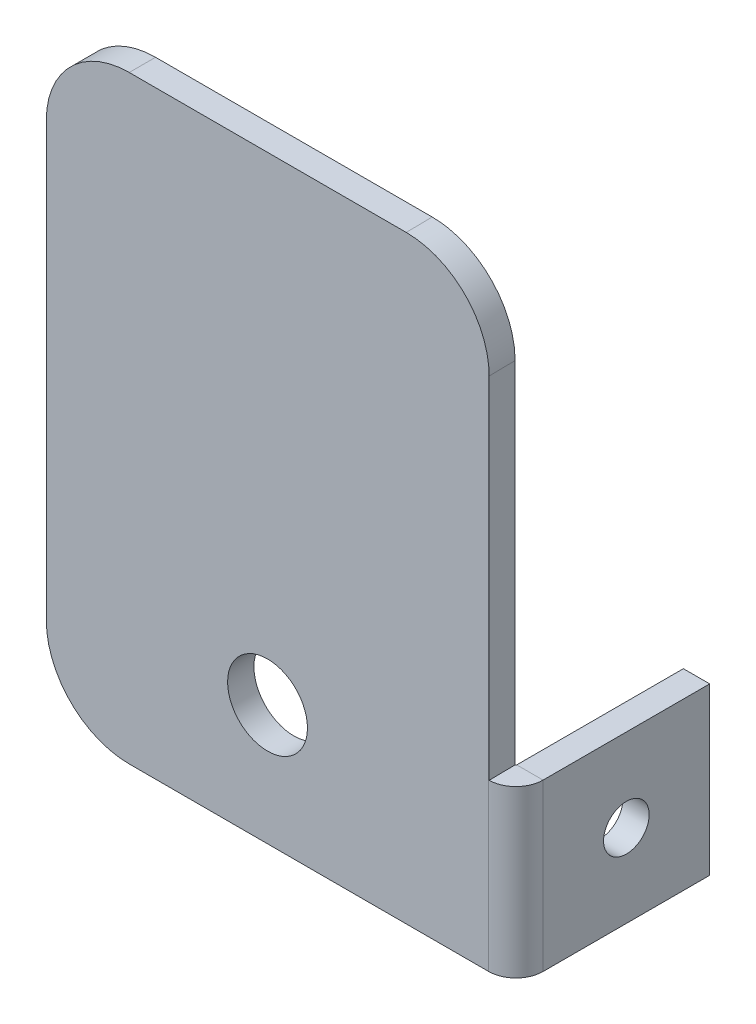
ISO-10303-21;
HEADER;
FILE_DESCRIPTION(('STEP AP214'),'2;1');
FILE_NAME('part.step','',(''),(''),'','','');
FILE_SCHEMA(('AUTOMOTIVE_DESIGN { 1 0 10303 214 1 1 1 1 }'));
ENDSEC;
DATA;
#1=APPLICATION_CONTEXT('core data for automotive mechanical design processes');
#2=APPLICATION_PROTOCOL_DEFINITION('international standard','automotive_design',2000,#1);
#3=PRODUCT_CONTEXT('',#1,'mechanical');
#4=PRODUCT('Part','Part','',(#3));
#5=PRODUCT_RELATED_PRODUCT_CATEGORY('part','',(#4));
#6=PRODUCT_DEFINITION_FORMATION('','',#4);
#7=PRODUCT_DEFINITION_CONTEXT('part definition',#1,'design');
#8=PRODUCT_DEFINITION('design','',#6,#7);
#9=PRODUCT_DEFINITION_SHAPE('','',#8);
#10=(LENGTH_UNIT() NAMED_UNIT(*) SI_UNIT(.MILLI.,.METRE.));
#11=(NAMED_UNIT(*) PLANE_ANGLE_UNIT() SI_UNIT($,.RADIAN.));
#12=(NAMED_UNIT(*) SI_UNIT($,.STERADIAN.) SOLID_ANGLE_UNIT());
#13=UNCERTAINTY_MEASURE_WITH_UNIT(LENGTH_MEASURE(1.E-05),#10,'distance_accuracy_value','');
#14=(GEOMETRIC_REPRESENTATION_CONTEXT(3) GLOBAL_UNCERTAINTY_ASSIGNED_CONTEXT((#13)) GLOBAL_UNIT_ASSIGNED_CONTEXT((#10,
#11,#12)) REPRESENTATION_CONTEXT('',''));
#15=CARTESIAN_POINT('',(0.,0.,0.));
#16=DIRECTION('',(0.,0.,1.));
#17=DIRECTION('',(1.,0.,0.));
#18=AXIS2_PLACEMENT_3D('',#15,#16,#17);
#19=CARTESIAN_POINT('',(26.7316212801133,-30.,6.625));
#20=DIRECTION('',(0.,1.,0.));
#21=DIRECTION('',(1.,0.,0.));
#22=AXIS2_PLACEMENT_3D('',#19,#20,#21);
#23=PLANE('',#22);
#24=DIRECTION('',(0.,0.,1.));
#25=VECTOR('',#24,1.);
#26=CARTESIAN_POINT('',(26.7316212801133,-30.,6.625));
#27=LINE('',#26,#25);
#28=CARTESIAN_POINT('',(26.7316212801132,-30.,-23.375));
#29=VERTEX_POINT('',#28);
#30=CARTESIAN_POINT('',(26.7316212801132,-30.,-3.275));
#31=VERTEX_POINT('',#30);
#32=EDGE_CURVE('E202',#29,#31,#27,.T.);
#33=ORIENTED_EDGE('',*,*,#32,.T.);
#34=DIRECTION('',(1.,0.,0.));
#35=VECTOR('',#34,1.);
#36=CARTESIAN_POINT('',(26.7316212801132,-30.,-3.275));
#37=LINE('',#36,#35);
#38=CARTESIAN_POINT('',(29.9066212801132,-30.,-3.27500000000001));
#39=VERTEX_POINT('',#38);
#40=EDGE_CURVE('E159',#31,#39,#37,.T.);
#41=ORIENTED_EDGE('',*,*,#40,.T.);
#42=DIRECTION('',(0.,0.,1.));
#43=VECTOR('',#42,1.);
#44=CARTESIAN_POINT('',(29.9066212801133,-30.,6.62499999999998));
#45=LINE('',#44,#43);
#46=CARTESIAN_POINT('',(29.9066212801132,-30.,-23.375));
#47=VERTEX_POINT('',#46);
#48=EDGE_CURVE('E207',#47,#39,#45,.T.);
#49=ORIENTED_EDGE('',*,*,#48,.F.);
#50=DIRECTION('',(1.,0.,0.));
#51=VECTOR('',#50,1.);
#52=CARTESIAN_POINT('',(26.7316212801132,-30.,-23.375));
#53=LINE('',#52,#51);
#54=EDGE_CURVE('E208',#29,#47,#53,.T.);
#55=ORIENTED_EDGE('',*,*,#54,.F.);
#56=EDGE_LOOP('',(#33,#41,#49,#55));
#57=FACE_BOUND('',#56,.T.);
#58=ADVANCED_FACE('F42',(#57),#23,.T.);
#59=CARTESIAN_POINT('',(26.7316212801135,-50.,60.0882425602265));
#60=DIRECTION('',(0.,-1.,0.));
#61=DIRECTION('',(0.,0.,-1.));
#62=AXIS2_PLACEMENT_3D('',#59,#60,#61);
#63=PLANE('',#62);
#64=DIRECTION('',(0.,0.,-1.));
#65=VECTOR('',#64,1.);
#66=CARTESIAN_POINT('',(29.9066212801135,-50.,60.0882425602265));
#67=LINE('',#66,#65);
#68=CARTESIAN_POINT('',(29.9066212801132,-50.,-3.27500000000001));
#69=VERTEX_POINT('',#68);
#70=CARTESIAN_POINT('',(29.9066212801132,-50.,-23.375));
#71=VERTEX_POINT('',#70);
#72=EDGE_CURVE('E177',#69,#71,#67,.T.);
#73=ORIENTED_EDGE('',*,*,#72,.F.);
#74=DIRECTION('',(-1.,0.,0.));
#75=VECTOR('',#74,1.);
#76=CARTESIAN_POINT('',(26.7316212801132,-50.,-3.275));
#77=LINE('',#76,#75);
#78=CARTESIAN_POINT('',(26.7316212801132,-50.,-3.275));
#79=VERTEX_POINT('',#78);
#80=EDGE_CURVE('E215',#69,#79,#77,.T.);
#81=ORIENTED_EDGE('',*,*,#80,.T.);
#82=DIRECTION('',(0.,0.,-1.));
#83=VECTOR('',#82,1.);
#84=CARTESIAN_POINT('',(26.7316212801135,-50.,60.0882425602265));
#85=LINE('',#84,#83);
#86=CARTESIAN_POINT('',(26.7316212801132,-50.,-23.375));
#87=VERTEX_POINT('',#86);
#88=EDGE_CURVE('E203',#79,#87,#85,.T.);
#89=ORIENTED_EDGE('',*,*,#88,.T.);
#90=DIRECTION('',(1.,0.,0.));
#91=VECTOR('',#90,1.);
#92=CARTESIAN_POINT('',(26.7316212801132,-50.,-23.375));
#93=LINE('',#92,#91);
#94=EDGE_CURVE('E211',#87,#71,#93,.T.);
#95=ORIENTED_EDGE('',*,*,#94,.T.);
#96=EDGE_LOOP('',(#73,#81,#89,#95));
#97=FACE_BOUND('',#96,.T.);
#98=ADVANCED_FACE('F304',(#97),#63,.T.);
#99=CARTESIAN_POINT('',(29.9066212801134,0.,33.3566212801132));
#100=DIRECTION('',(1.,0.,0.));
#101=DIRECTION('',(0.,0.,-1.));
#102=AXIS2_PLACEMENT_3D('',#99,#100,#101);
#103=PLANE('',#102);
#104=CARTESIAN_POINT('',(29.9066212801133,-40.,-13.325));
#105=DIRECTION('',(-1.,0.,0.));
#106=DIRECTION('',(0.,0.,1.));
#107=AXIS2_PLACEMENT_3D('',#104,#105,#106);
#108=CIRCLE('',#107,2.75);
#109=CARTESIAN_POINT('',(29.9066212801133,-40.,-10.575));
#110=VERTEX_POINT('',#109);
#111=EDGE_CURVE('E365',#110,#110,#108,.T.);
#112=ORIENTED_EDGE('',*,*,#111,.T.);
#113=EDGE_LOOP('',(#112));
#114=FACE_BOUND('',#113,.T.);
#115=ORIENTED_EDGE('',*,*,#48,.T.);
#116=DIRECTION('',(0.,-1.,0.));
#117=VECTOR('',#116,1.);
#118=CARTESIAN_POINT('',(29.9066212801132,0.,-3.27500000000001));
#119=LINE('',#118,#117);
#120=EDGE_CURVE('E217',#39,#69,#119,.T.);
#121=ORIENTED_EDGE('',*,*,#120,.T.);
#122=ORIENTED_EDGE('',*,*,#72,.T.);
#123=DIRECTION('',(0.,1.,0.));
#124=VECTOR('',#123,1.);
#125=CARTESIAN_POINT('',(29.9066212801132,-30.,-23.375));
#126=LINE('',#125,#124);
#127=EDGE_CURVE('E204',#71,#47,#126,.T.);
#128=ORIENTED_EDGE('',*,*,#127,.T.);
#129=EDGE_LOOP('',(#115,#121,#122,#128));
#130=FACE_BOUND('',#129,.T.);
#131=ADVANCED_FACE('F299',(#114,#130),#103,.T.);
#132=CARTESIAN_POINT('',(26.7316212801132,-30.,-23.375));
#133=DIRECTION('',(0.,0.,-1.));
#134=DIRECTION('',(-1.,0.,0.));
#135=AXIS2_PLACEMENT_3D('',#132,#133,#134);
#136=PLANE('',#135);
#137=ORIENTED_EDGE('',*,*,#127,.F.);
#138=ORIENTED_EDGE('',*,*,#94,.F.);
#139=DIRECTION('',(0.,1.,0.));
#140=VECTOR('',#139,1.);
#141=CARTESIAN_POINT('',(26.7316212801132,-30.,-23.375));
#142=LINE('',#141,#140);
#143=EDGE_CURVE('E199',#87,#29,#142,.T.);
#144=ORIENTED_EDGE('',*,*,#143,.T.);
#145=ORIENTED_EDGE('',*,*,#54,.T.);
#146=EDGE_LOOP('',(#137,#138,#144,#145));
#147=FACE_BOUND('',#146,.T.);
#148=ADVANCED_FACE('F296',(#147),#136,.T.);
#149=CARTESIAN_POINT('',(26.7316212801134,0.,33.3566212801132));
#150=DIRECTION('',(1.,0.,0.));
#151=DIRECTION('',(0.,0.,-1.));
#152=AXIS2_PLACEMENT_3D('',#149,#150,#151);
#153=PLANE('',#152);
#154=CARTESIAN_POINT('',(26.7316212801132,-40.,-13.325));
#155=DIRECTION('',(-1.,0.,0.));
#156=DIRECTION('',(0.,0.,1.));
#157=AXIS2_PLACEMENT_3D('',#154,#155,#156);
#158=CIRCLE('',#157,2.75);
#159=CARTESIAN_POINT('',(26.7316212801132,-40.,-10.575));
#160=VERTEX_POINT('',#159);
#161=EDGE_CURVE('E368',#160,#160,#158,.T.);
#162=ORIENTED_EDGE('',*,*,#161,.F.);
#163=EDGE_LOOP('',(#162));
#164=FACE_BOUND('',#163,.T.);
#165=DIRECTION('',(0.,-1.,0.));
#166=VECTOR('',#165,1.);
#167=CARTESIAN_POINT('',(26.7316212801132,0.,-3.275));
#168=LINE('',#167,#166);
#169=EDGE_CURVE('E210',#31,#79,#168,.T.);
#170=ORIENTED_EDGE('',*,*,#169,.F.);
#171=ORIENTED_EDGE('',*,*,#32,.F.);
#172=ORIENTED_EDGE('',*,*,#143,.F.);
#173=ORIENTED_EDGE('',*,*,#88,.F.);
#174=EDGE_LOOP('',(#170,#171,#172,#173));
#175=FACE_BOUND('',#174,.T.);
#176=ADVANCED_FACE('F280',(#164,#175),#153,.F.);
#177=CARTESIAN_POINT('',(-26.7316212801132,22.2316212801132,-3.175));
#178=DIRECTION('',(-1.,0.,0.));
#179=DIRECTION('',(0.,-1.,0.));
#180=AXIS2_PLACEMENT_3D('',#177,#178,#179);
#181=PLANE('',#180);
#182=DIRECTION('',(0.,-1.,0.));
#183=VECTOR('',#182,1.);
#184=CARTESIAN_POINT('',(-26.7316212801132,22.2316212801132,-3.175));
#185=LINE('',#184,#183);
#186=CARTESIAN_POINT('',(-26.7316212801132,12.2316212801132,-3.175));
#187=VERTEX_POINT('',#186);
#188=CARTESIAN_POINT('',(-26.7316212801132,-40.,-3.175));
#189=VERTEX_POINT('',#188);
#190=EDGE_CURVE('E191',#187,#189,#185,.T.);
#191=ORIENTED_EDGE('',*,*,#190,.T.);
#192=DIRECTION('',(0.,0.,1.));
#193=VECTOR('',#192,1.);
#194=CARTESIAN_POINT('',(-26.7316212801132,-40.,-3.175));
#195=LINE('',#194,#193);
#196=CARTESIAN_POINT('',(-26.7316212801132,-40.,0.));
#197=VERTEX_POINT('',#196);
#198=EDGE_CURVE('E230',#189,#197,#195,.T.);
#199=ORIENTED_EDGE('',*,*,#198,.T.);
#200=DIRECTION('',(0.,-1.,0.));
#201=VECTOR('',#200,1.);
#202=CARTESIAN_POINT('',(-26.7316212801132,22.2316212801132,0.));
#203=LINE('',#202,#201);
#204=CARTESIAN_POINT('',(-26.7316212801132,12.2316212801132,0.));
#205=VERTEX_POINT('',#204);
#206=EDGE_CURVE('E180',#205,#197,#203,.T.);
#207=ORIENTED_EDGE('',*,*,#206,.F.);
#208=DIRECTION('',(0.,0.,1.));
#209=VECTOR('',#208,1.);
#210=CARTESIAN_POINT('',(-26.7316212801132,12.2316212801132,-3.175));
#211=LINE('',#210,#209);
#212=EDGE_CURVE('E221',#205,#187,#211,.F.);
#213=ORIENTED_EDGE('',*,*,#212,.T.);
#214=EDGE_LOOP('',(#191,#199,#207,#213));
#215=FACE_BOUND('',#214,.T.);
#216=ADVANCED_FACE('F276',(#215),#181,.T.);
#217=CARTESIAN_POINT('',(0.,0.,-3.175));
#218=DIRECTION('',(0.,0.,1.));
#219=DIRECTION('',(1.,0.,0.));
#220=AXIS2_PLACEMENT_3D('',#217,#218,#219);
#221=PLANE('',#220);
#222=CARTESIAN_POINT('',(-0.049999999999991,-35.5,-3.175));
#223=DIRECTION('',(0.,0.,-1.));
#224=DIRECTION('',(-1.,0.,0.));
#225=AXIS2_PLACEMENT_3D('',#222,#223,#224);
#226=CIRCLE('',#225,4.815);
#227=CARTESIAN_POINT('',(-4.86499999999999,-35.5,-3.175));
#228=VERTEX_POINT('',#227);
#229=EDGE_CURVE('E166',#228,#228,#226,.T.);
#230=ORIENTED_EDGE('',*,*,#229,.F.);
#231=EDGE_LOOP('',(#230));
#232=FACE_BOUND('',#231,.T.);
#233=DIRECTION('',(1.,0.,0.));
#234=VECTOR('',#233,1.);
#235=CARTESIAN_POINT('',(-26.7316212801132,-50.,-3.175));
#236=LINE('',#235,#234);
#237=CARTESIAN_POINT('',(-16.7316212801132,-50.,-3.175));
#238=VERTEX_POINT('',#237);
#239=CARTESIAN_POINT('',(26.6316212801132,-50.,-3.175));
#240=VERTEX_POINT('',#239);
#241=EDGE_CURVE('E186',#238,#240,#236,.T.);
#242=ORIENTED_EDGE('',*,*,#241,.F.);
#243=CARTESIAN_POINT('',(-16.7316212801132,-40.,-3.175));
#244=DIRECTION('',(0.,0.,1.));
#245=DIRECTION('',(1.,0.,0.));
#246=AXIS2_PLACEMENT_3D('',#243,#244,#245);
#247=CIRCLE('',#246,10.);
#248=EDGE_CURVE('E245',#238,#189,#247,.F.);
#249=ORIENTED_EDGE('',*,*,#248,.T.);
#250=ORIENTED_EDGE('',*,*,#190,.F.);
#251=CARTESIAN_POINT('',(-16.7316212801132,12.2316212801132,-3.175));
#252=DIRECTION('',(0.,0.,1.));
#253=DIRECTION('',(1.,0.,0.));
#254=AXIS2_PLACEMENT_3D('',#251,#252,#253);
#255=CIRCLE('',#254,10.);
#256=CARTESIAN_POINT('',(-16.7316212801132,22.2316212801132,-3.175));
#257=VERTEX_POINT('',#256);
#258=EDGE_CURVE('E243',#187,#257,#255,.F.);
#259=ORIENTED_EDGE('',*,*,#258,.T.);
#260=DIRECTION('',(-1.,0.,0.));
#261=VECTOR('',#260,1.);
#262=CARTESIAN_POINT('',(26.7316212801132,22.2316212801132,-3.175));
#263=LINE('',#262,#261);
#264=CARTESIAN_POINT('',(16.631958378248,22.2316212801132,-3.175));
#265=VERTEX_POINT('',#264);
#266=EDGE_CURVE('E174',#265,#257,#263,.T.);
#267=ORIENTED_EDGE('',*,*,#266,.F.);
#268=CARTESIAN_POINT('',(16.631958378248,12.2316212801132,-3.175));
#269=DIRECTION('',(0.,0.,1.));
#270=DIRECTION('',(1.,0.,0.));
#271=AXIS2_PLACEMENT_3D('',#268,#269,#270);
#272=ELLIPSE('',#271,10.0012338273976,10.);
#273=CARTESIAN_POINT('',(26.6316212801132,12.4088560606318,-3.175));
#274=VERTEX_POINT('',#273);
#275=EDGE_CURVE('E241',#265,#274,#272,.F.);
#276=ORIENTED_EDGE('',*,*,#275,.T.);
#277=DIRECTION('',(0.,-1.,0.));
#278=VECTOR('',#277,1.);
#279=CARTESIAN_POINT('',(26.6316212801132,0.,-3.175));
#280=LINE('',#279,#278);
#281=EDGE_CURVE('E189',#274,#240,#280,.T.);
#282=ORIENTED_EDGE('',*,*,#281,.T.);
#283=EDGE_LOOP('',(#242,#249,#250,#259,#267,#276,#282));
#284=FACE_BOUND('',#283,.T.);
#285=ADVANCED_FACE('F279',(#232,#284),#221,.F.);
#286=CARTESIAN_POINT('',(-26.7316212801132,-50.,-3.175));
#287=DIRECTION('',(0.,-1.,0.));
#288=DIRECTION('',(1.,0.,0.));
#289=AXIS2_PLACEMENT_3D('',#286,#287,#288);
#290=PLANE('',#289);
#291=DIRECTION('',(1.,0.,0.));
#292=VECTOR('',#291,1.);
#293=CARTESIAN_POINT('',(-26.7316212801132,-50.,0.));
#294=LINE('',#293,#292);
#295=CARTESIAN_POINT('',(-16.7316212801132,-50.,0.));
#296=VERTEX_POINT('',#295);
#297=CARTESIAN_POINT('',(26.6316212801132,-50.,0.));
#298=VERTEX_POINT('',#297);
#299=EDGE_CURVE('E178',#296,#298,#294,.T.);
#300=ORIENTED_EDGE('',*,*,#299,.F.);
#301=DIRECTION('',(0.,0.,1.));
#302=VECTOR('',#301,1.);
#303=CARTESIAN_POINT('',(-16.7316212801132,-50.,-3.175));
#304=LINE('',#303,#302);
#305=EDGE_CURVE('E239',#296,#238,#304,.F.);
#306=ORIENTED_EDGE('',*,*,#305,.T.);
#307=ORIENTED_EDGE('',*,*,#241,.T.);
#308=DIRECTION('',(0.,0.,-1.));
#309=VECTOR('',#308,1.);
#310=CARTESIAN_POINT('',(26.6316212801132,-50.,-3.175));
#311=LINE('',#310,#309);
#312=EDGE_CURVE('E194',#298,#240,#311,.T.);
#313=ORIENTED_EDGE('',*,*,#312,.F.);
#314=EDGE_LOOP('',(#300,#306,#307,#313));
#315=FACE_BOUND('',#314,.T.);
#316=ADVANCED_FACE('F284',(#315),#290,.T.);
#317=CARTESIAN_POINT('',(0.,0.,0.));
#318=DIRECTION('',(0.,0.,1.));
#319=DIRECTION('',(1.,0.,0.));
#320=AXIS2_PLACEMENT_3D('',#317,#318,#319);
#321=PLANE('',#320);
#322=CARTESIAN_POINT('',(-0.049999999999991,-35.5,0.));
#323=DIRECTION('',(0.,0.,1.));
#324=DIRECTION('',(1.,0.,0.));
#325=AXIS2_PLACEMENT_3D('',#322,#323,#324);
#326=CIRCLE('',#325,4.815);
#327=CARTESIAN_POINT('',(4.76500000000001,-35.5,0.));
#328=VERTEX_POINT('',#327);
#329=EDGE_CURVE('E172',#328,#328,#326,.T.);
#330=ORIENTED_EDGE('',*,*,#329,.F.);
#331=EDGE_LOOP('',(#330));
#332=FACE_BOUND('',#331,.T.);
#333=ORIENTED_EDGE('',*,*,#206,.T.);
#334=CARTESIAN_POINT('',(-16.7316212801132,-40.,0.));
#335=DIRECTION('',(0.,0.,1.));
#336=DIRECTION('',(1.,0.,0.));
#337=AXIS2_PLACEMENT_3D('',#334,#335,#336);
#338=CIRCLE('',#337,10.);
#339=EDGE_CURVE('E237',#197,#296,#338,.T.);
#340=ORIENTED_EDGE('',*,*,#339,.T.);
#341=ORIENTED_EDGE('',*,*,#299,.T.);
#342=DIRECTION('',(0.,-1.,0.));
#343=VECTOR('',#342,1.);
#344=CARTESIAN_POINT('',(26.6316212801132,0.,0.));
#345=LINE('',#344,#343);
#346=CARTESIAN_POINT('',(26.6316212801132,13.2446282197171,0.));
#347=VERTEX_POINT('',#346);
#348=EDGE_CURVE('E154',#347,#298,#345,.T.);
#349=ORIENTED_EDGE('',*,*,#348,.F.);
#350=CARTESIAN_POINT('',(16.6818352639006,12.2316212801132,0.));
#351=DIRECTION('',(0.,0.,1.));
#352=DIRECTION('',(1.,0.,0.));
#353=AXIS2_PLACEMENT_3D('',#350,#351,#352);
#354=ELLIPSE('',#353,10.0012338273976,10.);
#355=CARTESIAN_POINT('',(16.6818352639006,22.2316212801132,0.));
#356=VERTEX_POINT('',#355);
#357=EDGE_CURVE('E233',#347,#356,#354,.T.);
#358=ORIENTED_EDGE('',*,*,#357,.T.);
#359=DIRECTION('',(-1.,0.,0.));
#360=VECTOR('',#359,1.);
#361=CARTESIAN_POINT('',(26.7316212801132,22.2316212801132,0.));
#362=LINE('',#361,#360);
#363=CARTESIAN_POINT('',(-16.7316212801132,22.2316212801132,0.));
#364=VERTEX_POINT('',#363);
#365=EDGE_CURVE('E183',#356,#364,#362,.T.);
#366=ORIENTED_EDGE('',*,*,#365,.T.);
#367=CARTESIAN_POINT('',(-16.7316212801132,12.2316212801132,0.));
#368=DIRECTION('',(0.,0.,1.));
#369=DIRECTION('',(1.,0.,0.));
#370=AXIS2_PLACEMENT_3D('',#367,#368,#369);
#371=CIRCLE('',#370,10.);
#372=EDGE_CURVE('E235',#364,#205,#371,.T.);
#373=ORIENTED_EDGE('',*,*,#372,.T.);
#374=EDGE_LOOP('',(#333,#340,#341,#349,#358,#366,#373));
#375=FACE_BOUND('',#374,.T.);
#376=ADVANCED_FACE('F288',(#332,#375),#321,.T.);
#377=CARTESIAN_POINT('',(26.7316212801132,22.2316212801132,-3.175));
#378=DIRECTION('',(0.,1.,0.));
#379=DIRECTION('',(0.,0.,1.));
#380=AXIS2_PLACEMENT_3D('',#377,#378,#379);
#381=PLANE('',#380);
#382=ORIENTED_EDGE('',*,*,#266,.T.);
#383=DIRECTION('',(0.,0.,1.));
#384=VECTOR('',#383,1.);
#385=CARTESIAN_POINT('',(-16.7316212801132,22.2316212801132,-3.175));
#386=LINE('',#385,#384);
#387=EDGE_CURVE('E250',#257,#364,#386,.T.);
#388=ORIENTED_EDGE('',*,*,#387,.T.);
#389=ORIENTED_EDGE('',*,*,#365,.F.);
#390=DIRECTION('',(0.0157073173118194,0.,0.999876632481661));
#391=VECTOR('',#390,1.);
#392=CARTESIAN_POINT('',(16.6344501652323,22.2316212801132,-3.01638096090961));
#393=LINE('',#392,#391);
#394=EDGE_CURVE('E247',#356,#265,#393,.F.);
#395=ORIENTED_EDGE('',*,*,#394,.T.);
#396=EDGE_LOOP('',(#382,#388,#389,#395));
#397=FACE_BOUND('',#396,.T.);
#398=ADVANCED_FACE('F273',(#397),#381,.T.);
#399=CARTESIAN_POINT('',(26.6316212801132,-30.,-3.275));
#400=DIRECTION('',(0.,-1.,0.));
#401=DIRECTION('',(0.,0.,-1.));
#402=AXIS2_PLACEMENT_3D('',#399,#400,#401);
#403=PLANE('',#402);
#404=DIRECTION('',(-0.0157073173118195,0.,-0.999876632481661));
#405=VECTOR('',#404,1.);
#406=CARTESIAN_POINT('',(26.6331920118444,-30.,-3.17501233675183));
#407=LINE('',#406,#405);
#408=CARTESIAN_POINT('',(26.6830627443095,-30.,-0.000404028622561642));
#409=VERTEX_POINT('',#408);
#410=CARTESIAN_POINT('',(26.6331920118444,-30.,-3.17501233675183));
#411=VERTEX_POINT('',#410);
#412=EDGE_CURVE('E145',#409,#411,#407,.T.);
#413=ORIENTED_EDGE('',*,*,#412,.F.);
#414=CARTESIAN_POINT('',(26.6316212801132,-30.,-3.275));
#415=DIRECTION('',(0.,-1.,0.));
#416=DIRECTION('',(0.,0.,-1.));
#417=AXIS2_PLACEMENT_3D('',#414,#415,#416);
#418=CIRCLE('',#417,3.275);
#419=EDGE_CURVE('E171',#409,#39,#418,.F.);
#420=ORIENTED_EDGE('',*,*,#419,.T.);
#421=ORIENTED_EDGE('',*,*,#40,.F.);
#422=CARTESIAN_POINT('',(26.6316212801132,-30.,-3.275));
#423=DIRECTION('',(0.,1.,0.));
#424=DIRECTION('',(0.,0.,-1.));
#425=AXIS2_PLACEMENT_3D('',#422,#423,#424);
#426=CIRCLE('',#425,0.0999999999999998);
#427=EDGE_CURVE('E144',#411,#31,#426,.T.);
#428=ORIENTED_EDGE('',*,*,#427,.F.);
#429=EDGE_LOOP('',(#413,#420,#421,#428));
#430=FACE_BOUND('',#429,.T.);
#431=ADVANCED_FACE('F157',(#430),#403,.F.);
#432=CARTESIAN_POINT('',(26.6316212801132,-50.,-3.275));
#433=DIRECTION('',(0.,1.,0.));
#434=DIRECTION('',(0.,0.,1.));
#435=AXIS2_PLACEMENT_3D('',#432,#433,#434);
#436=PLANE('',#435);
#437=ORIENTED_EDGE('',*,*,#80,.F.);
#438=CARTESIAN_POINT('',(26.6316212801132,-50.,-3.275));
#439=DIRECTION('',(0.,-1.,0.));
#440=DIRECTION('',(0.,0.,-1.));
#441=AXIS2_PLACEMENT_3D('',#438,#439,#440);
#442=CIRCLE('',#441,3.275);
#443=EDGE_CURVE('E163',#69,#298,#442,.T.);
#444=ORIENTED_EDGE('',*,*,#443,.T.);
#445=ORIENTED_EDGE('',*,*,#312,.T.);
#446=CARTESIAN_POINT('',(26.6316212801132,-50.,-3.275));
#447=DIRECTION('',(0.,-1.,0.));
#448=DIRECTION('',(0.,0.,1.));
#449=AXIS2_PLACEMENT_3D('',#446,#447,#448);
#450=CIRCLE('',#449,0.0999999999999996);
#451=EDGE_CURVE('E146',#79,#240,#450,.T.);
#452=ORIENTED_EDGE('',*,*,#451,.F.);
#453=EDGE_LOOP('',(#437,#444,#445,#452));
#454=FACE_BOUND('',#453,.T.);
#455=ADVANCED_FACE('F267',(#454),#436,.F.);
#456=CARTESIAN_POINT('',(26.6331920118444,-3.88418935994338,-3.17501233675183));
#457=DIRECTION('',(-0.999876632481661,0.,0.0157073173118194));
#458=DIRECTION('',(0.,-1.,0.));
#459=AXIS2_PLACEMENT_3D('',#456,#457,#458);
#460=PLANE('',#459);
#461=DIRECTION('',(0.,-1.,0.));
#462=VECTOR('',#461,1.);
#463=CARTESIAN_POINT('',(26.6331920118444,-30.,-3.17501233675183));
#464=LINE('',#463,#462);
#465=CARTESIAN_POINT('',(26.6331920118444,12.2316212801132,-3.17501233675183));
#466=VERTEX_POINT('',#465);
#467=EDGE_CURVE('E139',#466,#411,#464,.T.);
#468=ORIENTED_EDGE('',*,*,#467,.F.);
#469=DIRECTION('',(-0.0157073173118194,0.,-0.999876632481661));
#470=VECTOR('',#469,1.);
#471=CARTESIAN_POINT('',(26.6331920118444,12.2316212801132,-3.17501233675183));
#472=LINE('',#471,#470);
#473=CARTESIAN_POINT('',(26.6830627443095,12.2316212801132,-0.000404028622561642));
#474=VERTEX_POINT('',#473);
#475=EDGE_CURVE('E55',#466,#474,#472,.F.);
#476=ORIENTED_EDGE('',*,*,#475,.T.);
#477=DIRECTION('',(0.,-1.,0.));
#478=VECTOR('',#477,1.);
#479=CARTESIAN_POINT('',(26.6830627443095,59.1054519445164,-0.000404028622561642));
#480=LINE('',#479,#478);
#481=EDGE_CURVE('E150',#474,#409,#480,.T.);
#482=ORIENTED_EDGE('',*,*,#481,.T.);
#483=ORIENTED_EDGE('',*,*,#412,.T.);
#484=EDGE_LOOP('',(#468,#476,#482,#483));
#485=FACE_BOUND('',#484,.T.);
#486=ADVANCED_FACE('F149',(#485),#460,.F.);
#487=CARTESIAN_POINT('',(26.6316212801132,59.1054519445164,-3.275));
#488=DIRECTION('',(0.,-1.,0.));
#489=DIRECTION('',(0.,0.,-1.));
#490=AXIS2_PLACEMENT_3D('',#487,#488,#489);
#491=CYLINDRICAL_SURFACE('',#490,0.1);
#492=ORIENTED_EDGE('',*,*,#281,.F.);
#493=CARTESIAN_POINT('',(26.6316212801132,12.4088560606318,-3.175));
#494=CARTESIAN_POINT('',(26.6321448764373,12.3793192508439,-3.17500257025657));
#495=CARTESIAN_POINT('',(26.6325375689103,12.3497812809112,-3.17500488344751));
#496=CARTESIAN_POINT('',(26.6330611461542,12.2907030207383,-3.17500899569812));
#497=CARTESIAN_POINT('',(26.6331920309249,12.2611627304982,-3.17501079475779));
#498=CARTESIAN_POINT('',(26.6331920118444,12.2316212801132,-3.17501233675183));
#499=B_SPLINE_CURVE_WITH_KNOTS('',3,(#493,#494,#495,#496,#497,#498),.UNSPECIFIED.,.F.,.F.,(4,2,
4),(0.,0.0886217406976208,0.177243481448913),.UNSPECIFIED.);
#500=EDGE_CURVE('E69',#274,#466,#499,.T.);
#501=ORIENTED_EDGE('',*,*,#500,.T.);
#502=ORIENTED_EDGE('',*,*,#467,.T.);
#503=ORIENTED_EDGE('',*,*,#427,.T.);
#504=ORIENTED_EDGE('',*,*,#169,.T.);
#505=ORIENTED_EDGE('',*,*,#451,.T.);
#506=EDGE_LOOP('',(#492,#501,#502,#503,#504,#505));
#507=FACE_BOUND('',#506,.T.);
#508=ADVANCED_FACE('F141',(#507),#491,.F.);
#509=CARTESIAN_POINT('',(26.6316212801132,59.1054519445164,-3.275));
#510=DIRECTION('',(0.,-1.,0.));
#511=DIRECTION('',(0.,0.,-1.));
#512=AXIS2_PLACEMENT_3D('',#509,#510,#511);
#513=CYLINDRICAL_SURFACE('',#512,3.275);
#514=ORIENTED_EDGE('',*,*,#481,.F.);
#515=CARTESIAN_POINT('',(26.6830627443095,12.2316212801132,-0.000404028622561641));
#516=CARTESIAN_POINT('',(26.6830629411962,12.3162108031963,-0.000406139798762205));
#517=CARTESIAN_POINT('',(26.6819895686025,12.4008003137145,-0.000387169269398488));
#518=CARTESIAN_POINT('',(26.6776985433619,12.5698704712289,-0.000322926388244605));
#519=CARTESIAN_POINT('',(26.6744822704664,12.654351153251,-0.000277670962940551));
#520=CARTESIAN_POINT('',(26.6659082989725,12.8232037821213,-0.000176681843309282));
#521=CARTESIAN_POINT('',(26.6605506003133,12.9075757289665,-0.000120948148684986));
#522=CARTESIAN_POINT('',(26.6476928909653,13.076210862199,-3.36405569606585E-05));
#523=CARTESIAN_POINT('',(26.6401915035284,13.1604739436217,-2.08223418279417E-06));
#524=CARTESIAN_POINT('',(26.6316212801132,13.2446282197171,0.));
#525=B_SPLINE_CURVE_WITH_KNOTS('',3,(#515,#516,#517,#518,#519,#520,#521,#522,#523,#524),
.UNSPECIFIED.,.F.,.F.,(4,2,2,2,4),(0.,0.253761736750389,0.507360241365885,0.760958753171447,
1.01472050181016),.UNSPECIFIED.);
#526=EDGE_CURVE('E12',#474,#347,#525,.T.);
#527=ORIENTED_EDGE('',*,*,#526,.T.);
#528=ORIENTED_EDGE('',*,*,#348,.T.);
#529=ORIENTED_EDGE('',*,*,#443,.F.);
#530=ORIENTED_EDGE('',*,*,#120,.F.);
#531=ORIENTED_EDGE('',*,*,#419,.F.);
#532=EDGE_LOOP('',(#514,#527,#528,#529,#530,#531));
#533=FACE_BOUND('',#532,.T.);
#534=ADVANCED_FACE('F260',(#533),#513,.T.);
#535=CARTESIAN_POINT('',(-0.049999999999991,-35.5,6.825));
#536=DIRECTION('',(0.,0.,-1.));
#537=DIRECTION('',(-1.,0.,0.));
#538=AXIS2_PLACEMENT_3D('',#535,#536,#537);
#539=CYLINDRICAL_SURFACE('',#538,4.815);
#540=ORIENTED_EDGE('',*,*,#329,.T.);
#541=EDGE_LOOP('',(#540));
#542=FACE_BOUND('',#541,.T.);
#543=ORIENTED_EDGE('',*,*,#229,.T.);
#544=EDGE_LOOP('',(#543));
#545=FACE_BOUND('',#544,.T.);
#546=ADVANCED_FACE('F261',(#542,#545),#539,.F.);
#547=CARTESIAN_POINT('',(-16.7316212801132,-40.,-3.175));
#548=DIRECTION('',(0.,0.,1.));
#549=DIRECTION('',(1.,0.,0.));
#550=AXIS2_PLACEMENT_3D('',#547,#548,#549);
#551=CYLINDRICAL_SURFACE('',#550,10.);
#552=ORIENTED_EDGE('',*,*,#248,.F.);
#553=ORIENTED_EDGE('',*,*,#305,.F.);
#554=ORIENTED_EDGE('',*,*,#339,.F.);
#555=ORIENTED_EDGE('',*,*,#198,.F.);
#556=EDGE_LOOP('',(#552,#553,#554,#555));
#557=FACE_BOUND('',#556,.T.);
#558=ADVANCED_FACE('F314',(#557),#551,.T.);
#559=CARTESIAN_POINT('',(-16.7316212801132,12.2316212801132,-3.175));
#560=DIRECTION('',(0.,0.,1.));
#561=DIRECTION('',(1.,0.,0.));
#562=AXIS2_PLACEMENT_3D('',#559,#560,#561);
#563=CYLINDRICAL_SURFACE('',#562,10.);
#564=ORIENTED_EDGE('',*,*,#258,.F.);
#565=ORIENTED_EDGE('',*,*,#212,.F.);
#566=ORIENTED_EDGE('',*,*,#372,.F.);
#567=ORIENTED_EDGE('',*,*,#387,.F.);
#568=EDGE_LOOP('',(#564,#565,#566,#567));
#569=FACE_BOUND('',#568,.T.);
#570=ADVANCED_FACE('F316',(#569),#563,.T.);
#571=CARTESIAN_POINT('',(16.6344501652323,12.2316212801132,-3.01638096090961));
#572=DIRECTION('',(0.0157073173118194,0.,0.999876632481661));
#573=DIRECTION('',(0.999876632481661,0.,-0.0157073173118194));
#574=AXIS2_PLACEMENT_3D('',#571,#572,#573);
#575=CYLINDRICAL_SURFACE('',#574,10.);
#576=ORIENTED_EDGE('',*,*,#526,.F.);
#577=ORIENTED_EDGE('',*,*,#475,.F.);
#578=ORIENTED_EDGE('',*,*,#500,.F.);
#579=ORIENTED_EDGE('',*,*,#275,.F.);
#580=ORIENTED_EDGE('',*,*,#394,.F.);
#581=ORIENTED_EDGE('',*,*,#357,.F.);
#582=EDGE_LOOP('',(#576,#577,#578,#579,#580,#581));
#583=FACE_BOUND('',#582,.T.);
#584=ADVANCED_FACE('F44',(#583),#575,.T.);
#585=CARTESIAN_POINT('',(29.9066212801133,-40.,-13.325));
#586=DIRECTION('',(-1.,0.,0.));
#587=DIRECTION('',(0.,0.,1.));
#588=AXIS2_PLACEMENT_3D('',#585,#586,#587);
#589=CYLINDRICAL_SURFACE('',#588,2.75);
#590=ORIENTED_EDGE('',*,*,#111,.F.);
#591=EDGE_LOOP('',(#590));
#592=FACE_BOUND('',#591,.T.);
#593=ORIENTED_EDGE('',*,*,#161,.T.);
#594=EDGE_LOOP('',(#593));
#595=FACE_BOUND('',#594,.T.);
#596=ADVANCED_FACE('F323',(#592,#595),#589,.F.);
#597=CLOSED_SHELL('',(#58,#98,#131,#148,#176,#216,#285,#316,#376,#398,#431,#455,#486,#508,#534,
#546,#558,#570,#584,#596));
#598=MANIFOLD_SOLID_BREP('B2',#597);
#599=ADVANCED_BREP_SHAPE_REPRESENTATION('',(#18,#598),#14);
#600=SHAPE_DEFINITION_REPRESENTATION(#9,#599);
ENDSEC;
END-ISO-10303-21;
